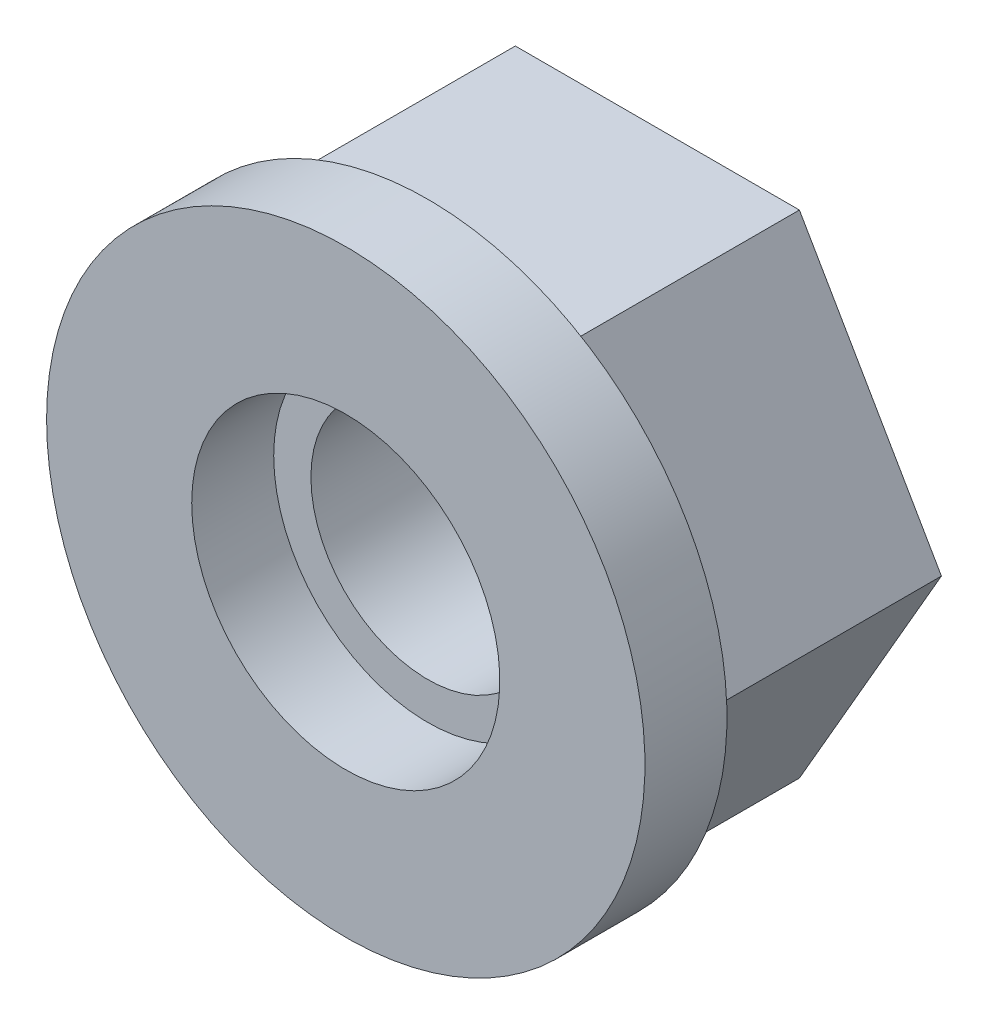
ISO-10303-21;
HEADER;
FILE_DESCRIPTION(('STEP AP214'),'2;1');
FILE_NAME('part.step','',(''),(''),'','','');
FILE_SCHEMA(('AUTOMOTIVE_DESIGN { 1 0 10303 214 1 1 1 1 }'));
ENDSEC;
DATA;
#1=APPLICATION_CONTEXT('core data for automotive mechanical design processes');
#2=APPLICATION_PROTOCOL_DEFINITION('international standard','automotive_design',2000,#1);
#3=PRODUCT_CONTEXT('',#1,'mechanical');
#4=PRODUCT('Part','Part','',(#3));
#5=PRODUCT_RELATED_PRODUCT_CATEGORY('part','',(#4));
#6=PRODUCT_DEFINITION_FORMATION('','',#4);
#7=PRODUCT_DEFINITION_CONTEXT('part definition',#1,'design');
#8=PRODUCT_DEFINITION('design','',#6,#7);
#9=PRODUCT_DEFINITION_SHAPE('','',#8);
#10=(LENGTH_UNIT() NAMED_UNIT(*) SI_UNIT(.MILLI.,.METRE.));
#11=(NAMED_UNIT(*) PLANE_ANGLE_UNIT() SI_UNIT($,.RADIAN.));
#12=(NAMED_UNIT(*) SI_UNIT($,.STERADIAN.) SOLID_ANGLE_UNIT());
#13=UNCERTAINTY_MEASURE_WITH_UNIT(LENGTH_MEASURE(1.E-05),#10,'distance_accuracy_value','');
#14=(GEOMETRIC_REPRESENTATION_CONTEXT(3) GLOBAL_UNCERTAINTY_ASSIGNED_CONTEXT((#13)) GLOBAL_UNIT_ASSIGNED_CONTEXT((#10,
#11,#12)) REPRESENTATION_CONTEXT('',''));
#15=CARTESIAN_POINT('',(0.,0.,0.));
#16=DIRECTION('',(0.,0.,1.));
#17=DIRECTION('',(1.,0.,0.));
#18=AXIS2_PLACEMENT_3D('',#15,#16,#17);
#19=CARTESIAN_POINT('',(0.,0.,0.));
#20=DIRECTION('',(0.,0.,1.));
#21=DIRECTION('',(1.,0.,0.));
#22=AXIS2_PLACEMENT_3D('',#19,#20,#21);
#23=PLANE('',#22);
#24=DIRECTION('',(0.500000000000002,-0.866025403784437,0.));
#25=VECTOR('',#24,1.);
#26=CARTESIAN_POINT('',(3.46410161513775,0.,0.));
#27=LINE('',#26,#25);
#28=CARTESIAN_POINT('',(1.73205080756886,3.00000000000001,0.));
#29=VERTEX_POINT('',#28);
#30=CARTESIAN_POINT('',(3.46410161513775,0.,0.));
#31=VERTEX_POINT('',#30);
#32=EDGE_CURVE('E72',#29,#31,#27,.T.);
#33=ORIENTED_EDGE('',*,*,#32,.T.);
#34=DIRECTION('',(-0.499999999999998,-0.86602540378444,0.));
#35=VECTOR('',#34,1.);
#36=CARTESIAN_POINT('',(1.73205080756888,-2.99999999999999,0.));
#37=LINE('',#36,#35);
#38=CARTESIAN_POINT('',(1.73205080756888,-2.99999999999999,0.));
#39=VERTEX_POINT('',#38);
#40=EDGE_CURVE('E105',#31,#39,#37,.T.);
#41=ORIENTED_EDGE('',*,*,#40,.T.);
#42=DIRECTION('',(-1.,0.,0.));
#43=VECTOR('',#42,1.);
#44=CARTESIAN_POINT('',(-1.73205080756888,-3.,0.));
#45=LINE('',#44,#43);
#46=CARTESIAN_POINT('',(-1.73205080756887,-3.,0.));
#47=VERTEX_POINT('',#46);
#48=EDGE_CURVE('E116',#39,#47,#45,.T.);
#49=ORIENTED_EDGE('',*,*,#48,.T.);
#50=DIRECTION('',(-0.500000000000001,0.866025403784438,0.));
#51=VECTOR('',#50,1.);
#52=CARTESIAN_POINT('',(-3.46410161513775,0.,0.));
#53=LINE('',#52,#51);
#54=CARTESIAN_POINT('',(-3.46410161513775,0.,0.));
#55=VERTEX_POINT('',#54);
#56=EDGE_CURVE('E121',#47,#55,#53,.T.);
#57=ORIENTED_EDGE('',*,*,#56,.T.);
#58=DIRECTION('',(0.5,0.866025403784439,0.));
#59=VECTOR('',#58,1.);
#60=CARTESIAN_POINT('',(-1.73205080756888,3.,0.));
#61=LINE('',#60,#59);
#62=CARTESIAN_POINT('',(-1.73205080756888,3.,0.));
#63=VERTEX_POINT('',#62);
#64=EDGE_CURVE('E88',#55,#63,#61,.T.);
#65=ORIENTED_EDGE('',*,*,#64,.T.);
#66=DIRECTION('',(1.,0.,0.));
#67=VECTOR('',#66,1.);
#68=CARTESIAN_POINT('',(1.73205080756887,3.,0.));
#69=LINE('',#68,#67);
#70=EDGE_CURVE('E66',#63,#29,#69,.T.);
#71=ORIENTED_EDGE('',*,*,#70,.T.);
#72=EDGE_LOOP('',(#33,#41,#49,#57,#65,#71));
#73=FACE_BOUND('',#72,.T.);
#74=CARTESIAN_POINT('',(0.,0.,0.));
#75=DIRECTION('',(0.,0.,-1.));
#76=DIRECTION('',(-1.,0.,0.));
#77=AXIS2_PLACEMENT_3D('',#74,#75,#76);
#78=CIRCLE('',#77,1.425);
#79=CARTESIAN_POINT('',(-1.425,0.,0.));
#80=VERTEX_POINT('',#79);
#81=EDGE_CURVE('E18',#80,#80,#78,.F.);
#82=ORIENTED_EDGE('',*,*,#81,.T.);
#83=EDGE_LOOP('',(#82));
#84=FACE_BOUND('',#83,.T.);
#85=ADVANCED_FACE('F15',(#73,#84),#23,.F.);
#86=CARTESIAN_POINT('',(0.,0.,2.8));
#87=DIRECTION('',(0.,0.,-1.));
#88=DIRECTION('',(-1.,0.,0.));
#89=AXIS2_PLACEMENT_3D('',#86,#87,#88);
#90=CYLINDRICAL_SURFACE('',#89,1.425);
#91=ORIENTED_EDGE('',*,*,#81,.F.);
#92=EDGE_LOOP('',(#91));
#93=FACE_BOUND('',#92,.T.);
#94=CARTESIAN_POINT('',(0.,0.,2.8));
#95=DIRECTION('',(0.,0.,-1.));
#96=DIRECTION('',(-1.,0.,0.));
#97=AXIS2_PLACEMENT_3D('',#94,#95,#96);
#98=CIRCLE('',#97,1.425);
#99=CARTESIAN_POINT('',(-1.425,0.,2.8));
#100=VERTEX_POINT('',#99);
#101=EDGE_CURVE('E102',#100,#100,#98,.T.);
#102=ORIENTED_EDGE('',*,*,#101,.F.);
#103=EDGE_LOOP('',(#102));
#104=FACE_BOUND('',#103,.T.);
#105=ADVANCED_FACE('F251',(#93,#104),#90,.F.);
#106=CARTESIAN_POINT('',(3.46410161513775,0.,2.8));
#107=DIRECTION('',(-0.866025403784437,-0.500000000000002,0.));
#108=DIRECTION('',(0.500000000000002,-0.866025403784437,0.));
#109=AXIS2_PLACEMENT_3D('',#106,#107,#108);
#110=PLANE('',#109);
#111=DIRECTION('',(0.,0.,1.));
#112=VECTOR('',#111,1.);
#113=CARTESIAN_POINT('',(1.73205080756886,3.,2.8));
#114=LINE('',#113,#112);
#115=CARTESIAN_POINT('',(1.73205080756886,3.00000000000001,2.8));
#116=VERTEX_POINT('',#115);
#117=EDGE_CURVE('E75',#29,#116,#114,.T.);
#118=ORIENTED_EDGE('',*,*,#117,.T.);
#119=DIRECTION('',(-0.500000000000003,0.866025403784437,0.));
#120=VECTOR('',#119,1.);
#121=CARTESIAN_POINT('',(3.46410161513775,0.,2.8));
#122=LINE('',#121,#120);
#123=CARTESIAN_POINT('',(3.46410161513775,0.,2.8));
#124=VERTEX_POINT('',#123);
#125=EDGE_CURVE('E104',#124,#116,#122,.T.);
#126=ORIENTED_EDGE('',*,*,#125,.F.);
#127=DIRECTION('',(0.,0.,1.));
#128=VECTOR('',#127,1.);
#129=CARTESIAN_POINT('',(3.46410161513775,0.,2.8));
#130=LINE('',#129,#128);
#131=EDGE_CURVE('E77',#124,#31,#130,.F.);
#132=ORIENTED_EDGE('',*,*,#131,.T.);
#133=ORIENTED_EDGE('',*,*,#32,.F.);
#134=EDGE_LOOP('',(#118,#126,#132,#133));
#135=FACE_BOUND('',#134,.T.);
#136=ADVANCED_FACE('F73',(#135),#110,.F.);
#137=CARTESIAN_POINT('',(1.73205080756887,3.,2.8));
#138=DIRECTION('',(0.,-1.,0.));
#139=DIRECTION('',(1.,0.,0.));
#140=AXIS2_PLACEMENT_3D('',#137,#138,#139);
#141=PLANE('',#140);
#142=DIRECTION('',(0.,0.,1.));
#143=VECTOR('',#142,1.);
#144=CARTESIAN_POINT('',(-1.73205080756888,3.,2.8));
#145=LINE('',#144,#143);
#146=CARTESIAN_POINT('',(-1.73205080756888,3.,2.8));
#147=VERTEX_POINT('',#146);
#148=EDGE_CURVE('E89',#63,#147,#145,.T.);
#149=ORIENTED_EDGE('',*,*,#148,.T.);
#150=DIRECTION('',(-1.,0.,0.));
#151=VECTOR('',#150,1.);
#152=CARTESIAN_POINT('',(0.,3.00000000000001,2.8));
#153=LINE('',#152,#151);
#154=EDGE_CURVE('E83',#116,#147,#153,.T.);
#155=ORIENTED_EDGE('',*,*,#154,.F.);
#156=ORIENTED_EDGE('',*,*,#117,.F.);
#157=ORIENTED_EDGE('',*,*,#70,.F.);
#158=EDGE_LOOP('',(#149,#155,#156,#157));
#159=FACE_BOUND('',#158,.T.);
#160=ADVANCED_FACE('F82',(#159),#141,.F.);
#161=CARTESIAN_POINT('',(-1.73205080756888,3.,2.8));
#162=DIRECTION('',(0.866025403784439,-0.5,0.));
#163=DIRECTION('',(0.5,0.866025403784439,0.));
#164=AXIS2_PLACEMENT_3D('',#161,#162,#163);
#165=PLANE('',#164);
#166=DIRECTION('',(0.,0.,1.));
#167=VECTOR('',#166,1.);
#168=CARTESIAN_POINT('',(-3.46410161513775,0.,2.8));
#169=LINE('',#168,#167);
#170=CARTESIAN_POINT('',(-3.46410161513775,0.,2.8));
#171=VERTEX_POINT('',#170);
#172=EDGE_CURVE('E123',#55,#171,#169,.T.);
#173=ORIENTED_EDGE('',*,*,#172,.T.);
#174=DIRECTION('',(-0.499999999999998,-0.866025403784439,0.));
#175=VECTOR('',#174,1.);
#176=CARTESIAN_POINT('',(-1.73205080756888,3.,2.8));
#177=LINE('',#176,#175);
#178=EDGE_CURVE('E130',#147,#171,#177,.T.);
#179=ORIENTED_EDGE('',*,*,#178,.F.);
#180=ORIENTED_EDGE('',*,*,#148,.F.);
#181=ORIENTED_EDGE('',*,*,#64,.F.);
#182=EDGE_LOOP('',(#173,#179,#180,#181));
#183=FACE_BOUND('',#182,.T.);
#184=ADVANCED_FACE('F129',(#183),#165,.F.);
#185=CARTESIAN_POINT('',(-3.46410161513775,0.,2.8));
#186=DIRECTION('',(0.866025403784438,0.500000000000001,0.));
#187=DIRECTION('',(-0.500000000000001,0.866025403784438,0.));
#188=AXIS2_PLACEMENT_3D('',#185,#186,#187);
#189=PLANE('',#188);
#190=DIRECTION('',(0.,0.,1.));
#191=VECTOR('',#190,1.);
#192=CARTESIAN_POINT('',(-1.73205080756887,-3.,2.8));
#193=LINE('',#192,#191);
#194=CARTESIAN_POINT('',(-1.73205080756887,-3.,2.8));
#195=VERTEX_POINT('',#194);
#196=EDGE_CURVE('E118',#47,#195,#193,.T.);
#197=ORIENTED_EDGE('',*,*,#196,.T.);
#198=DIRECTION('',(0.500000000000001,-0.866025403784438,0.));
#199=VECTOR('',#198,1.);
#200=CARTESIAN_POINT('',(-3.46410161513775,0.,2.8));
#201=LINE('',#200,#199);
#202=EDGE_CURVE('E132',#171,#195,#201,.T.);
#203=ORIENTED_EDGE('',*,*,#202,.F.);
#204=ORIENTED_EDGE('',*,*,#172,.F.);
#205=ORIENTED_EDGE('',*,*,#56,.F.);
#206=EDGE_LOOP('',(#197,#203,#204,#205));
#207=FACE_BOUND('',#206,.T.);
#208=ADVANCED_FACE('F133',(#207),#189,.F.);
#209=CARTESIAN_POINT('',(-1.73205080756888,-3.,2.8));
#210=DIRECTION('',(0.,1.,0.));
#211=DIRECTION('',(-1.,0.,0.));
#212=AXIS2_PLACEMENT_3D('',#209,#210,#211);
#213=PLANE('',#212);
#214=DIRECTION('',(0.,0.,1.));
#215=VECTOR('',#214,1.);
#216=CARTESIAN_POINT('',(1.73205080756888,-2.99999999999999,2.8));
#217=LINE('',#216,#215);
#218=CARTESIAN_POINT('',(1.73205080756888,-2.99999999999999,2.8));
#219=VERTEX_POINT('',#218);
#220=EDGE_CURVE('E111',#39,#219,#217,.T.);
#221=ORIENTED_EDGE('',*,*,#220,.T.);
#222=DIRECTION('',(-1.,0.,0.));
#223=VECTOR('',#222,1.);
#224=CARTESIAN_POINT('',(0.,-3.,2.8));
#225=LINE('',#224,#223);
#226=EDGE_CURVE('E33',#195,#219,#225,.F.);
#227=ORIENTED_EDGE('',*,*,#226,.F.);
#228=ORIENTED_EDGE('',*,*,#196,.F.);
#229=ORIENTED_EDGE('',*,*,#48,.F.);
#230=EDGE_LOOP('',(#221,#227,#228,#229));
#231=FACE_BOUND('',#230,.T.);
#232=ADVANCED_FACE('F145',(#231),#213,.F.);
#233=CARTESIAN_POINT('',(1.73205080756888,-2.99999999999999,2.8));
#234=DIRECTION('',(-0.86602540378444,0.499999999999998,0.));
#235=DIRECTION('',(-0.499999999999998,-0.86602540378444,0.));
#236=AXIS2_PLACEMENT_3D('',#233,#234,#235);
#237=PLANE('',#236);
#238=ORIENTED_EDGE('',*,*,#131,.F.);
#239=DIRECTION('',(0.499999999999998,0.866025403784439,0.));
#240=VECTOR('',#239,1.);
#241=CARTESIAN_POINT('',(1.73205080756888,-2.99999999999999,2.8));
#242=LINE('',#241,#240);
#243=EDGE_CURVE('E101',#219,#124,#242,.T.);
#244=ORIENTED_EDGE('',*,*,#243,.F.);
#245=ORIENTED_EDGE('',*,*,#220,.F.);
#246=ORIENTED_EDGE('',*,*,#40,.F.);
#247=EDGE_LOOP('',(#238,#244,#245,#246));
#248=FACE_BOUND('',#247,.T.);
#249=ADVANCED_FACE('F143',(#248),#237,.F.);
#250=CARTESIAN_POINT('',(0.,0.,2.8));
#251=DIRECTION('',(0.,0.,1.));
#252=DIRECTION('',(1.,0.,0.));
#253=AXIS2_PLACEMENT_3D('',#250,#251,#252);
#254=PLANE('',#253);
#255=CARTESIAN_POINT('',(0.,0.,2.8));
#256=DIRECTION('',(0.,0.,-1.));
#257=DIRECTION('',(-1.,0.,0.));
#258=AXIS2_PLACEMENT_3D('',#255,#256,#257);
#259=CIRCLE('',#258,1.87869767441861);
#260=CARTESIAN_POINT('',(-1.87869767441861,0.,2.8));
#261=VERTEX_POINT('',#260);
#262=EDGE_CURVE('E99',#261,#261,#259,.F.);
#263=ORIENTED_EDGE('',*,*,#262,.T.);
#264=EDGE_LOOP('',(#263));
#265=FACE_BOUND('',#264,.T.);
#266=ORIENTED_EDGE('',*,*,#101,.T.);
#267=EDGE_LOOP('',(#266));
#268=FACE_BOUND('',#267,.T.);
#269=ADVANCED_FACE('F153',(#265,#268),#254,.T.);
#270=CARTESIAN_POINT('',(0.,0.,2.8));
#271=DIRECTION('',(0.,0.,-1.));
#272=DIRECTION('',(-1.,0.,0.));
#273=AXIS2_PLACEMENT_3D('',#270,#271,#272);
#274=PLANE('',#273);
#275=CARTESIAN_POINT('',(0.,0.,2.8));
#276=DIRECTION('',(0.,0.,-1.));
#277=DIRECTION('',(-1.,0.,0.));
#278=AXIS2_PLACEMENT_3D('',#275,#276,#277);
#279=CIRCLE('',#278,3.64848859555695);
#280=CARTESIAN_POINT('',(-3.64848859555695,0.,2.8));
#281=VERTEX_POINT('',#280);
#282=EDGE_CURVE('E96',#281,#281,#279,.F.);
#283=ORIENTED_EDGE('',*,*,#282,.F.);
#284=EDGE_LOOP('',(#283));
#285=FACE_BOUND('',#284,.T.);
#286=ORIENTED_EDGE('',*,*,#226,.T.);
#287=ORIENTED_EDGE('',*,*,#243,.T.);
#288=ORIENTED_EDGE('',*,*,#125,.T.);
#289=ORIENTED_EDGE('',*,*,#154,.T.);
#290=ORIENTED_EDGE('',*,*,#178,.T.);
#291=ORIENTED_EDGE('',*,*,#202,.T.);
#292=EDGE_LOOP('',(#286,#287,#288,#289,#290,#291));
#293=FACE_BOUND('',#292,.T.);
#294=ADVANCED_FACE('F139',(#285,#293),#274,.T.);
#295=CARTESIAN_POINT('',(0.,0.,3.8));
#296=DIRECTION('',(0.,0.,-1.));
#297=DIRECTION('',(-1.,0.,0.));
#298=AXIS2_PLACEMENT_3D('',#295,#296,#297);
#299=CYLINDRICAL_SURFACE('',#298,1.87869767441861);
#300=ORIENTED_EDGE('',*,*,#262,.F.);
#301=EDGE_LOOP('',(#300));
#302=FACE_BOUND('',#301,.T.);
#303=CARTESIAN_POINT('',(0.,0.,3.8));
#304=DIRECTION('',(0.,0.,-1.));
#305=DIRECTION('',(-1.,0.,0.));
#306=AXIS2_PLACEMENT_3D('',#303,#304,#305);
#307=CIRCLE('',#306,1.87869767441861);
#308=CARTESIAN_POINT('',(-1.87869767441861,0.,3.8));
#309=VERTEX_POINT('',#308);
#310=EDGE_CURVE('E24',#309,#309,#307,.F.);
#311=ORIENTED_EDGE('',*,*,#310,.T.);
#312=EDGE_LOOP('',(#311));
#313=FACE_BOUND('',#312,.T.);
#314=ADVANCED_FACE('F164',(#302,#313),#299,.F.);
#315=CARTESIAN_POINT('',(0.,0.,3.8));
#316=DIRECTION('',(0.,0.,-1.));
#317=DIRECTION('',(-1.,0.,0.));
#318=AXIS2_PLACEMENT_3D('',#315,#316,#317);
#319=CYLINDRICAL_SURFACE('',#318,3.64848859555695);
#320=ORIENTED_EDGE('',*,*,#282,.T.);
#321=EDGE_LOOP('',(#320));
#322=FACE_BOUND('',#321,.T.);
#323=CARTESIAN_POINT('',(0.,0.,3.8));
#324=DIRECTION('',(0.,0.,-1.));
#325=DIRECTION('',(-1.,0.,0.));
#326=AXIS2_PLACEMENT_3D('',#323,#324,#325);
#327=CIRCLE('',#326,3.64848859555695);
#328=CARTESIAN_POINT('',(-3.64848859555695,0.,3.8));
#329=VERTEX_POINT('',#328);
#330=EDGE_CURVE('E10',#329,#329,#327,.T.);
#331=ORIENTED_EDGE('',*,*,#330,.T.);
#332=EDGE_LOOP('',(#331));
#333=FACE_BOUND('',#332,.T.);
#334=ADVANCED_FACE('F158',(#322,#333),#319,.T.);
#335=CARTESIAN_POINT('',(0.,0.,3.8));
#336=DIRECTION('',(0.,0.,-1.));
#337=DIRECTION('',(-1.,0.,0.));
#338=AXIS2_PLACEMENT_3D('',#335,#336,#337);
#339=PLANE('',#338);
#340=ORIENTED_EDGE('',*,*,#330,.F.);
#341=EDGE_LOOP('',(#340));
#342=FACE_BOUND('',#341,.T.);
#343=ORIENTED_EDGE('',*,*,#310,.F.);
#344=EDGE_LOOP('',(#343));
#345=FACE_BOUND('',#344,.T.);
#346=ADVANCED_FACE('F156',(#342,#345),#339,.F.);
#347=CLOSED_SHELL('',(#85,#105,#136,#160,#184,#208,#232,#249,#269,#294,#314,#334,#346));
#348=MANIFOLD_SOLID_BREP('B1',#347);
#349=ADVANCED_BREP_SHAPE_REPRESENTATION('',(#18,#348),#14);
#350=SHAPE_DEFINITION_REPRESENTATION(#9,#349);
ENDSEC;
END-ISO-10303-21;
